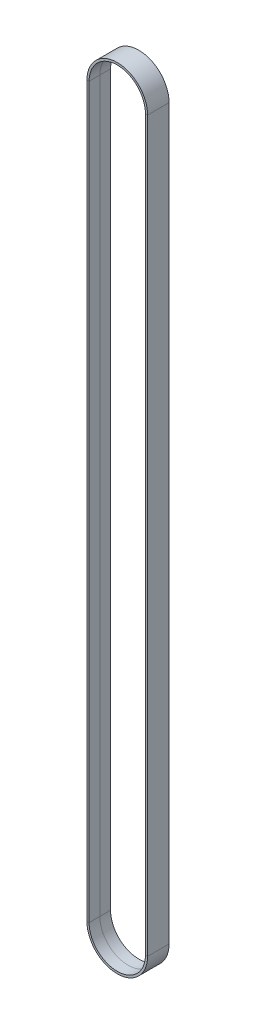
ISO-10303-21;
HEADER;
FILE_DESCRIPTION(('STEP AP214'),'2;1');
FILE_NAME('part.step','',(''),(''),'','','');
FILE_SCHEMA(('AUTOMOTIVE_DESIGN { 1 0 10303 214 1 1 1 1 }'));
ENDSEC;
DATA;
#1=APPLICATION_CONTEXT('core data for automotive mechanical design processes');
#2=APPLICATION_PROTOCOL_DEFINITION('international standard','automotive_design',2000,#1);
#3=PRODUCT_CONTEXT('',#1,'mechanical');
#4=PRODUCT('Part','Part','',(#3));
#5=PRODUCT_RELATED_PRODUCT_CATEGORY('part','',(#4));
#6=PRODUCT_DEFINITION_FORMATION('','',#4);
#7=PRODUCT_DEFINITION_CONTEXT('part definition',#1,'design');
#8=PRODUCT_DEFINITION('design','',#6,#7);
#9=PRODUCT_DEFINITION_SHAPE('','',#8);
#10=(LENGTH_UNIT() NAMED_UNIT(*) SI_UNIT(.MILLI.,.METRE.));
#11=(NAMED_UNIT(*) PLANE_ANGLE_UNIT() SI_UNIT($,.RADIAN.));
#12=(NAMED_UNIT(*) SI_UNIT($,.STERADIAN.) SOLID_ANGLE_UNIT());
#13=UNCERTAINTY_MEASURE_WITH_UNIT(LENGTH_MEASURE(1.E-05),#10,'distance_accuracy_value','');
#14=(GEOMETRIC_REPRESENTATION_CONTEXT(3) GLOBAL_UNCERTAINTY_ASSIGNED_CONTEXT((#13)) GLOBAL_UNIT_ASSIGNED_CONTEXT((#10,
#11,#12)) REPRESENTATION_CONTEXT('',''));
#15=CARTESIAN_POINT('',(0.,0.,0.));
#16=DIRECTION('',(0.,0.,1.));
#17=DIRECTION('',(1.,0.,0.));
#18=AXIS2_PLACEMENT_3D('',#15,#16,#17);
#19=CARTESIAN_POINT('',(-26.2499999999862,-7.0265520336124E-13,9.99999999999998));
#20=DIRECTION('',(0.,0.,-1.));
#21=DIRECTION('',(-1.,0.,0.));
#22=AXIS2_PLACEMENT_3D('',#19,#20,#21);
#23=PLANE('',#22);
#24=DIRECTION('',(-1.,0.,0.));
#25=VECTOR('',#24,1.);
#26=CARTESIAN_POINT('',(-26.2499999999862,0.,9.99999999999998));
#27=LINE('',#26,#25);
#28=CARTESIAN_POINT('',(-26.2500000000138,-2.22044604925031E-13,9.99999999999998));
#29=VERTEX_POINT('',#28);
#30=CARTESIAN_POINT('',(-28.2500000000138,-2.22044604925031E-13,9.99999999999998));
#31=VERTEX_POINT('',#30);
#32=EDGE_CURVE('E168',#29,#31,#27,.T.);
#33=ORIENTED_EDGE('',*,*,#32,.F.);
#34=CARTESIAN_POINT('',(-1.37667655053519E-11,3.04201108747293E-11,9.99999999999998));
#35=DIRECTION('',(0.,0.,-1.));
#36=DIRECTION('',(-1.,-1.1856291839285E-12,0.));
#37=AXIS2_PLACEMENT_3D('',#34,#35,#36);
#38=CIRCLE('',#37,26.2499999999725);
#39=CARTESIAN_POINT('',(26.2499999999862,0.,9.99999999999998));
#40=VERTEX_POINT('',#39);
#41=EDGE_CURVE('E167',#29,#40,#38,.T.);
#42=ORIENTED_EDGE('',*,*,#41,.T.);
#43=DIRECTION('',(1.,0.,0.));
#44=VECTOR('',#43,1.);
#45=CARTESIAN_POINT('',(26.2499999999862,0.,9.99999999999998));
#46=LINE('',#45,#44);
#47=CARTESIAN_POINT('',(28.2499999999862,0.,9.99999999999998));
#48=VERTEX_POINT('',#47);
#49=EDGE_CURVE('E147',#40,#48,#46,.T.);
#50=ORIENTED_EDGE('',*,*,#49,.T.);
#51=CARTESIAN_POINT('',(-1.37667655053519E-11,3.04201108747293E-11,9.99999999999998));
#52=DIRECTION('',(0.,0.,-1.));
#53=DIRECTION('',(-1.,-1.1035859013332E-12,0.));
#54=AXIS2_PLACEMENT_3D('',#51,#52,#53);
#55=CIRCLE('',#54,28.2499999999725);
#56=EDGE_CURVE('E172',#31,#48,#55,.T.);
#57=ORIENTED_EDGE('',*,*,#56,.F.);
#58=EDGE_LOOP('',(#33,#42,#50,#57));
#59=FACE_BOUND('',#58,.T.);
#60=ADVANCED_FACE('F35',(#59),#23,.F.);
#61=CARTESIAN_POINT('',(26.2499999999862,0.,9.99999999999998));
#62=DIRECTION('',(0.,0.,-1.));
#63=DIRECTION('',(-1.,0.,0.));
#64=AXIS2_PLACEMENT_3D('',#61,#62,#63);
#65=PLANE('',#64);
#66=DIRECTION('',(0.,-1.,0.));
#67=VECTOR('',#66,1.);
#68=CARTESIAN_POINT('',(28.2499999999862,0.,9.99999999999998));
#69=LINE('',#68,#67);
#70=CARTESIAN_POINT('',(28.2499999999862,-678.678709754641,9.99999999999998));
#71=VERTEX_POINT('',#70);
#72=EDGE_CURVE('E130',#48,#71,#69,.T.);
#73=ORIENTED_EDGE('',*,*,#72,.F.);
#74=ORIENTED_EDGE('',*,*,#49,.F.);
#75=DIRECTION('',(0.,-1.,0.));
#76=VECTOR('',#75,1.);
#77=CARTESIAN_POINT('',(26.2499999999862,0.,9.99999999999998));
#78=LINE('',#77,#76);
#79=CARTESIAN_POINT('',(26.2499999999862,-678.678709754641,9.99999999999998));
#80=VERTEX_POINT('',#79);
#81=EDGE_CURVE('E152',#40,#80,#78,.T.);
#82=ORIENTED_EDGE('',*,*,#81,.T.);
#83=DIRECTION('',(1.,0.,0.));
#84=VECTOR('',#83,1.);
#85=CARTESIAN_POINT('',(26.2499999999862,-678.678709754641,9.99999999999998));
#86=LINE('',#85,#84);
#87=EDGE_CURVE('E164',#80,#71,#86,.T.);
#88=ORIENTED_EDGE('',*,*,#87,.T.);
#89=EDGE_LOOP('',(#73,#74,#82,#88));
#90=FACE_BOUND('',#89,.T.);
#91=ADVANCED_FACE('F151',(#90),#65,.F.);
#92=CARTESIAN_POINT('',(28.2499999999862,0.,9.99999999999998));
#93=DIRECTION('',(-1.,0.,0.));
#94=DIRECTION('',(0.,0.,1.));
#95=AXIS2_PLACEMENT_3D('',#92,#93,#94);
#96=PLANE('',#95);
#97=DIRECTION('',(0.,-1.,0.));
#98=VECTOR('',#97,1.);
#99=CARTESIAN_POINT('',(28.2499999999862,0.,-10.));
#100=LINE('',#99,#98);
#101=CARTESIAN_POINT('',(28.2499999999862,0.,-10.));
#102=VERTEX_POINT('',#101);
#103=CARTESIAN_POINT('',(28.2499999999862,-678.678709754641,-10.));
#104=VERTEX_POINT('',#103);
#105=EDGE_CURVE('E123',#102,#104,#100,.T.);
#106=ORIENTED_EDGE('',*,*,#105,.F.);
#107=DIRECTION('',(0.,0.,-1.));
#108=VECTOR('',#107,1.);
#109=CARTESIAN_POINT('',(28.2499999999862,0.,9.99999999999998));
#110=LINE('',#109,#108);
#111=EDGE_CURVE('E154',#48,#102,#110,.T.);
#112=ORIENTED_EDGE('',*,*,#111,.F.);
#113=ORIENTED_EDGE('',*,*,#72,.T.);
#114=DIRECTION('',(0.,0.,-1.));
#115=VECTOR('',#114,1.);
#116=CARTESIAN_POINT('',(28.2499999999862,-678.678709754641,9.99999999999998));
#117=LINE('',#116,#115);
#118=EDGE_CURVE('E230',#71,#104,#117,.T.);
#119=ORIENTED_EDGE('',*,*,#118,.T.);
#120=EDGE_LOOP('',(#106,#112,#113,#119));
#121=FACE_BOUND('',#120,.T.);
#122=ADVANCED_FACE('F252',(#121),#96,.F.);
#123=CARTESIAN_POINT('',(26.2499999999862,0.,-10.));
#124=DIRECTION('',(0.,0.,1.));
#125=DIRECTION('',(1.,0.,0.));
#126=AXIS2_PLACEMENT_3D('',#123,#124,#125);
#127=PLANE('',#126);
#128=DIRECTION('',(0.,-1.,0.));
#129=VECTOR('',#128,1.);
#130=CARTESIAN_POINT('',(26.2499999999862,0.,-10.));
#131=LINE('',#130,#129);
#132=CARTESIAN_POINT('',(26.2499999999862,0.,-10.));
#133=VERTEX_POINT('',#132);
#134=CARTESIAN_POINT('',(26.2499999999862,-678.678709754641,-10.));
#135=VERTEX_POINT('',#134);
#136=EDGE_CURVE('E116',#133,#135,#131,.T.);
#137=ORIENTED_EDGE('',*,*,#136,.F.);
#138=DIRECTION('',(-1.,0.,0.));
#139=VECTOR('',#138,1.);
#140=CARTESIAN_POINT('',(26.2499999999862,0.,-10.));
#141=LINE('',#140,#139);
#142=EDGE_CURVE('E178',#102,#133,#141,.T.);
#143=ORIENTED_EDGE('',*,*,#142,.F.);
#144=ORIENTED_EDGE('',*,*,#105,.T.);
#145=DIRECTION('',(-1.,0.,0.));
#146=VECTOR('',#145,1.);
#147=CARTESIAN_POINT('',(26.2499999999862,-678.678709754641,-10.));
#148=LINE('',#147,#146);
#149=EDGE_CURVE('E214',#104,#135,#148,.T.);
#150=ORIENTED_EDGE('',*,*,#149,.T.);
#151=EDGE_LOOP('',(#137,#143,#144,#150));
#152=FACE_BOUND('',#151,.T.);
#153=ADVANCED_FACE('F254',(#152),#127,.F.);
#154=CARTESIAN_POINT('',(26.2499999999862,0.,0.));
#155=DIRECTION('',(1.,0.,0.));
#156=DIRECTION('',(0.,0.,-1.));
#157=AXIS2_PLACEMENT_3D('',#154,#155,#156);
#158=PLANE('',#157);
#159=DIRECTION('',(0.,-1.,0.));
#160=VECTOR('',#159,1.);
#161=CARTESIAN_POINT('',(26.2499999999862,0.,0.));
#162=LINE('',#161,#160);
#163=CARTESIAN_POINT('',(26.2499999999862,0.,0.));
#164=VERTEX_POINT('',#163);
#165=CARTESIAN_POINT('',(26.2499999999862,-678.678709754641,0.));
#166=VERTEX_POINT('',#165);
#167=EDGE_CURVE('E183',#164,#166,#162,.T.);
#168=ORIENTED_EDGE('',*,*,#167,.F.);
#169=DIRECTION('',(0.,0.,1.));
#170=VECTOR('',#169,1.);
#171=CARTESIAN_POINT('',(26.2499999999862,0.,0.));
#172=LINE('',#171,#170);
#173=EDGE_CURVE('E175',#133,#164,#172,.T.);
#174=ORIENTED_EDGE('',*,*,#173,.F.);
#175=ORIENTED_EDGE('',*,*,#136,.T.);
#176=DIRECTION('',(0.,0.,1.));
#177=VECTOR('',#176,1.);
#178=CARTESIAN_POINT('',(26.2499999999862,-678.678709754641,0.));
#179=LINE('',#178,#177);
#180=EDGE_CURVE('E201',#135,#166,#179,.T.);
#181=ORIENTED_EDGE('',*,*,#180,.T.);
#182=EDGE_LOOP('',(#168,#174,#175,#181));
#183=FACE_BOUND('',#182,.T.);
#184=ADVANCED_FACE('F200',(#183),#158,.F.);
#185=CARTESIAN_POINT('',(26.2499999999862,0.,0.));
#186=DIRECTION('',(1.,0.,0.));
#187=DIRECTION('',(0.,0.,-1.));
#188=AXIS2_PLACEMENT_3D('',#185,#186,#187);
#189=PLANE('',#188);
#190=DIRECTION('',(0.,0.,1.));
#191=VECTOR('',#190,1.);
#192=CARTESIAN_POINT('',(26.2499999999862,-678.678709754641,0.));
#193=LINE('',#192,#191);
#194=EDGE_CURVE('E162',#166,#80,#193,.T.);
#195=ORIENTED_EDGE('',*,*,#194,.T.);
#196=ORIENTED_EDGE('',*,*,#81,.F.);
#197=DIRECTION('',(0.,0.,1.));
#198=VECTOR('',#197,1.);
#199=CARTESIAN_POINT('',(26.2499999999862,0.,0.));
#200=LINE('',#199,#198);
#201=EDGE_CURVE('E161',#164,#40,#200,.T.);
#202=ORIENTED_EDGE('',*,*,#201,.F.);
#203=ORIENTED_EDGE('',*,*,#167,.T.);
#204=EDGE_LOOP('',(#195,#196,#202,#203));
#205=FACE_BOUND('',#204,.T.);
#206=ADVANCED_FACE('F159',(#205),#189,.F.);
#207=CARTESIAN_POINT('',(26.2499999999862,-678.678709754642,9.99999999999998));
#208=DIRECTION('',(0.,0.,-1.));
#209=DIRECTION('',(-1.,0.,0.));
#210=AXIS2_PLACEMENT_3D('',#207,#208,#209);
#211=PLANE('',#210);
#212=CARTESIAN_POINT('',(-1.37667655053519E-11,-678.678709754611,9.99999999999998));
#213=DIRECTION('',(0.,0.,-1.));
#214=DIRECTION('',(1.,-1.10039804210635E-12,0.));
#215=AXIS2_PLACEMENT_3D('',#212,#213,#214);
#216=CIRCLE('',#215,28.25);
#217=CARTESIAN_POINT('',(-28.2500000000138,-678.67870975458,9.99999999999998));
#218=VERTEX_POINT('',#217);
#219=EDGE_CURVE('E228',#71,#218,#216,.T.);
#220=ORIENTED_EDGE('',*,*,#219,.F.);
#221=ORIENTED_EDGE('',*,*,#87,.F.);
#222=CARTESIAN_POINT('',(-1.37667655053519E-11,-678.678709754611,9.99999999999998));
#223=DIRECTION('',(0.,0.,-1.));
#224=DIRECTION('',(1.,-1.1842378929335E-12,0.));
#225=AXIS2_PLACEMENT_3D('',#222,#223,#224);
#226=CIRCLE('',#225,26.25);
#227=CARTESIAN_POINT('',(-26.2500000000138,-678.67870975458,9.99999999999998));
#228=VERTEX_POINT('',#227);
#229=EDGE_CURVE('E182',#80,#228,#226,.T.);
#230=ORIENTED_EDGE('',*,*,#229,.T.);
#231=DIRECTION('',(-1.,0.,0.));
#232=VECTOR('',#231,1.);
#233=CARTESIAN_POINT('',(-26.2500000000138,-678.67870975458,9.99999999999998));
#234=LINE('',#233,#232);
#235=EDGE_CURVE('E239',#228,#218,#234,.T.);
#236=ORIENTED_EDGE('',*,*,#235,.T.);
#237=EDGE_LOOP('',(#220,#221,#230,#236));
#238=FACE_BOUND('',#237,.T.);
#239=ADVANCED_FACE('F247',(#238),#211,.F.);
#240=CARTESIAN_POINT('',(-1.37667655053519E-11,-678.678709754611,0.));
#241=DIRECTION('',(0.,0.,-1.));
#242=DIRECTION('',(-1.,0.,0.));
#243=AXIS2_PLACEMENT_3D('',#240,#241,#242);
#244=CYLINDRICAL_SURFACE('',#243,28.25);
#245=CARTESIAN_POINT('',(-1.37667655053519E-11,-678.678709754611,-10.));
#246=DIRECTION('',(0.,0.,-1.));
#247=DIRECTION('',(1.,-1.10039804210635E-12,0.));
#248=AXIS2_PLACEMENT_3D('',#245,#246,#247);
#249=CIRCLE('',#248,28.25);
#250=CARTESIAN_POINT('',(-28.2500000000138,-678.67870975458,-10.));
#251=VERTEX_POINT('',#250);
#252=EDGE_CURVE('E102',#104,#251,#249,.T.);
#253=ORIENTED_EDGE('',*,*,#252,.F.);
#254=ORIENTED_EDGE('',*,*,#118,.F.);
#255=ORIENTED_EDGE('',*,*,#219,.T.);
#256=DIRECTION('',(0.,0.,-1.));
#257=VECTOR('',#256,1.);
#258=CARTESIAN_POINT('',(-28.2500000000138,-678.67870975458,9.99999999999998));
#259=LINE('',#258,#257);
#260=EDGE_CURVE('E226',#218,#251,#259,.T.);
#261=ORIENTED_EDGE('',*,*,#260,.T.);
#262=EDGE_LOOP('',(#253,#254,#255,#261));
#263=FACE_BOUND('',#262,.T.);
#264=ADVANCED_FACE('F251',(#263),#244,.T.);
#265=CARTESIAN_POINT('',(26.2499999999862,-678.678709754642,-10.));
#266=DIRECTION('',(0.,0.,1.));
#267=DIRECTION('',(1.,0.,0.));
#268=AXIS2_PLACEMENT_3D('',#265,#266,#267);
#269=PLANE('',#268);
#270=CARTESIAN_POINT('',(-1.37667655053519E-11,-678.678709754611,-10.));
#271=DIRECTION('',(0.,0.,-1.));
#272=DIRECTION('',(1.,-1.1842378929335E-12,0.));
#273=AXIS2_PLACEMENT_3D('',#270,#271,#272);
#274=CIRCLE('',#273,26.25);
#275=CARTESIAN_POINT('',(-26.2500000000138,-678.67870975458,-10.));
#276=VERTEX_POINT('',#275);
#277=EDGE_CURVE('E94',#135,#276,#274,.T.);
#278=ORIENTED_EDGE('',*,*,#277,.F.);
#279=ORIENTED_EDGE('',*,*,#149,.F.);
#280=ORIENTED_EDGE('',*,*,#252,.T.);
#281=DIRECTION('',(1.,0.,0.));
#282=VECTOR('',#281,1.);
#283=CARTESIAN_POINT('',(-26.2500000000138,-678.67870975458,-10.));
#284=LINE('',#283,#282);
#285=EDGE_CURVE('E211',#251,#276,#284,.T.);
#286=ORIENTED_EDGE('',*,*,#285,.T.);
#287=EDGE_LOOP('',(#278,#279,#280,#286));
#288=FACE_BOUND('',#287,.T.);
#289=ADVANCED_FACE('F279',(#288),#269,.F.);
#290=CARTESIAN_POINT('',(-1.37667655053519E-11,-678.678709754611,0.));
#291=DIRECTION('',(0.,0.,-1.));
#292=DIRECTION('',(-1.,0.,0.));
#293=AXIS2_PLACEMENT_3D('',#290,#291,#292);
#294=CYLINDRICAL_SURFACE('',#293,26.25);
#295=CARTESIAN_POINT('',(-1.37667655053519E-11,-678.678709754611,0.));
#296=DIRECTION('',(0.,0.,-1.));
#297=DIRECTION('',(1.,-1.1842378929335E-12,0.));
#298=AXIS2_PLACEMENT_3D('',#295,#296,#297);
#299=CIRCLE('',#298,26.25);
#300=CARTESIAN_POINT('',(-26.2500000000138,-678.67870975458,0.));
#301=VERTEX_POINT('',#300);
#302=EDGE_CURVE('E85',#166,#301,#299,.T.);
#303=ORIENTED_EDGE('',*,*,#302,.F.);
#304=ORIENTED_EDGE('',*,*,#180,.F.);
#305=ORIENTED_EDGE('',*,*,#277,.T.);
#306=DIRECTION('',(0.,0.,1.));
#307=VECTOR('',#306,1.);
#308=CARTESIAN_POINT('',(-26.2500000000138,-678.67870975458,0.));
#309=LINE('',#308,#307);
#310=EDGE_CURVE('E188',#276,#301,#309,.T.);
#311=ORIENTED_EDGE('',*,*,#310,.T.);
#312=EDGE_LOOP('',(#303,#304,#305,#311));
#313=FACE_BOUND('',#312,.T.);
#314=ADVANCED_FACE('F289',(#313),#294,.F.);
#315=CARTESIAN_POINT('',(-1.37667655053519E-11,-678.678709754611,0.));
#316=DIRECTION('',(0.,0.,-1.));
#317=DIRECTION('',(-1.,0.,0.));
#318=AXIS2_PLACEMENT_3D('',#315,#316,#317);
#319=CYLINDRICAL_SURFACE('',#318,26.25);
#320=DIRECTION('',(0.,0.,1.));
#321=VECTOR('',#320,1.);
#322=CARTESIAN_POINT('',(-26.2500000000138,-678.67870975458,0.));
#323=LINE('',#322,#321);
#324=EDGE_CURVE('E184',#301,#228,#323,.T.);
#325=ORIENTED_EDGE('',*,*,#324,.T.);
#326=ORIENTED_EDGE('',*,*,#229,.F.);
#327=ORIENTED_EDGE('',*,*,#194,.F.);
#328=ORIENTED_EDGE('',*,*,#302,.T.);
#329=EDGE_LOOP('',(#325,#326,#327,#328));
#330=FACE_BOUND('',#329,.T.);
#331=ADVANCED_FACE('F272',(#330),#319,.F.);
#332=CARTESIAN_POINT('',(-26.2500000000138,-678.67870975458,9.99999999999998));
#333=DIRECTION('',(0.,0.,-1.));
#334=DIRECTION('',(-1.,0.,0.));
#335=AXIS2_PLACEMENT_3D('',#332,#333,#334);
#336=PLANE('',#335);
#337=DIRECTION('',(0.,1.,0.));
#338=VECTOR('',#337,1.);
#339=CARTESIAN_POINT('',(-28.2500000000138,-678.67870975458,9.99999999999998));
#340=LINE('',#339,#338);
#341=EDGE_CURVE('E224',#218,#31,#340,.T.);
#342=ORIENTED_EDGE('',*,*,#341,.F.);
#343=ORIENTED_EDGE('',*,*,#235,.F.);
#344=DIRECTION('',(0.,1.,0.));
#345=VECTOR('',#344,1.);
#346=CARTESIAN_POINT('',(-26.2500000000138,-678.67870975458,9.99999999999998));
#347=LINE('',#346,#345);
#348=EDGE_CURVE('E185',#228,#29,#347,.T.);
#349=ORIENTED_EDGE('',*,*,#348,.T.);
#350=ORIENTED_EDGE('',*,*,#32,.T.);
#351=EDGE_LOOP('',(#342,#343,#349,#350));
#352=FACE_BOUND('',#351,.T.);
#353=ADVANCED_FACE('F268',(#352),#336,.F.);
#354=CARTESIAN_POINT('',(-28.2500000000138,-678.67870975458,9.99999999999998));
#355=DIRECTION('',(1.,0.,0.));
#356=DIRECTION('',(0.,0.,-1.));
#357=AXIS2_PLACEMENT_3D('',#354,#355,#356);
#358=PLANE('',#357);
#359=DIRECTION('',(0.,1.,0.));
#360=VECTOR('',#359,1.);
#361=CARTESIAN_POINT('',(-28.2500000000138,-678.67870975458,-10.));
#362=LINE('',#361,#360);
#363=CARTESIAN_POINT('',(-28.2500000000138,-2.22044604925031E-13,-10.));
#364=VERTEX_POINT('',#363);
#365=EDGE_CURVE('E209',#251,#364,#362,.T.);
#366=ORIENTED_EDGE('',*,*,#365,.F.);
#367=ORIENTED_EDGE('',*,*,#260,.F.);
#368=ORIENTED_EDGE('',*,*,#341,.T.);
#369=DIRECTION('',(0.,0.,-1.));
#370=VECTOR('',#369,1.);
#371=CARTESIAN_POINT('',(-28.2499999999862,0.,9.99999999999998));
#372=LINE('',#371,#370);
#373=EDGE_CURVE('E221',#31,#364,#372,.T.);
#374=ORIENTED_EDGE('',*,*,#373,.T.);
#375=EDGE_LOOP('',(#366,#367,#368,#374));
#376=FACE_BOUND('',#375,.T.);
#377=ADVANCED_FACE('F271',(#376),#358,.F.);
#378=CARTESIAN_POINT('',(-26.2500000000138,-678.67870975458,-10.));
#379=DIRECTION('',(0.,0.,1.));
#380=DIRECTION('',(1.,0.,0.));
#381=AXIS2_PLACEMENT_3D('',#378,#379,#380);
#382=PLANE('',#381);
#383=DIRECTION('',(0.,1.,0.));
#384=VECTOR('',#383,1.);
#385=CARTESIAN_POINT('',(-26.2500000000138,-678.67870975458,-10.));
#386=LINE('',#385,#384);
#387=CARTESIAN_POINT('',(-26.2500000000138,-2.22044604925031E-13,-10.));
#388=VERTEX_POINT('',#387);
#389=EDGE_CURVE('E60',#276,#388,#386,.T.);
#390=ORIENTED_EDGE('',*,*,#389,.F.);
#391=ORIENTED_EDGE('',*,*,#285,.F.);
#392=ORIENTED_EDGE('',*,*,#365,.T.);
#393=DIRECTION('',(1.,0.,0.));
#394=VECTOR('',#393,1.);
#395=CARTESIAN_POINT('',(-26.2499999999862,0.,-10.));
#396=LINE('',#395,#394);
#397=EDGE_CURVE('E207',#364,#388,#396,.T.);
#398=ORIENTED_EDGE('',*,*,#397,.T.);
#399=EDGE_LOOP('',(#390,#391,#392,#398));
#400=FACE_BOUND('',#399,.T.);
#401=ADVANCED_FACE('F300',(#400),#382,.F.);
#402=CARTESIAN_POINT('',(-26.2500000000138,-678.67870975458,0.));
#403=DIRECTION('',(-1.,0.,0.));
#404=DIRECTION('',(0.,0.,1.));
#405=AXIS2_PLACEMENT_3D('',#402,#403,#404);
#406=PLANE('',#405);
#407=DIRECTION('',(0.,1.,0.));
#408=VECTOR('',#407,1.);
#409=CARTESIAN_POINT('',(-26.2500000000138,-678.67870975458,0.));
#410=LINE('',#409,#408);
#411=CARTESIAN_POINT('',(-26.2500000000138,-2.22044604925031E-13,0.));
#412=VERTEX_POINT('',#411);
#413=EDGE_CURVE('E52',#301,#412,#410,.T.);
#414=ORIENTED_EDGE('',*,*,#413,.F.);
#415=ORIENTED_EDGE('',*,*,#310,.F.);
#416=ORIENTED_EDGE('',*,*,#389,.T.);
#417=DIRECTION('',(0.,0.,1.));
#418=VECTOR('',#417,1.);
#419=CARTESIAN_POINT('',(-26.2499999999862,0.,0.));
#420=LINE('',#419,#418);
#421=EDGE_CURVE('E193',#388,#412,#420,.T.);
#422=ORIENTED_EDGE('',*,*,#421,.T.);
#423=EDGE_LOOP('',(#414,#415,#416,#422));
#424=FACE_BOUND('',#423,.T.);
#425=ADVANCED_FACE('F292',(#424),#406,.F.);
#426=CARTESIAN_POINT('',(-26.2500000000138,-678.67870975458,0.));
#427=DIRECTION('',(-1.,0.,0.));
#428=DIRECTION('',(0.,0.,1.));
#429=AXIS2_PLACEMENT_3D('',#426,#427,#428);
#430=PLANE('',#429);
#431=DIRECTION('',(0.,0.,1.));
#432=VECTOR('',#431,1.);
#433=CARTESIAN_POINT('',(-26.2499999999862,0.,0.));
#434=LINE('',#433,#432);
#435=EDGE_CURVE('E39',#412,#29,#434,.T.);
#436=ORIENTED_EDGE('',*,*,#435,.T.);
#437=ORIENTED_EDGE('',*,*,#348,.F.);
#438=ORIENTED_EDGE('',*,*,#324,.F.);
#439=ORIENTED_EDGE('',*,*,#413,.T.);
#440=EDGE_LOOP('',(#436,#437,#438,#439));
#441=FACE_BOUND('',#440,.T.);
#442=ADVANCED_FACE('F194',(#441),#430,.F.);
#443=CARTESIAN_POINT('',(-1.37667655053519E-11,3.04201108747293E-11,0.));
#444=DIRECTION('',(0.,0.,-1.));
#445=DIRECTION('',(-1.,0.,0.));
#446=AXIS2_PLACEMENT_3D('',#443,#444,#445);
#447=CYLINDRICAL_SURFACE('',#446,28.2499999999725);
#448=ORIENTED_EDGE('',*,*,#56,.T.);
#449=ORIENTED_EDGE('',*,*,#111,.T.);
#450=CARTESIAN_POINT('',(-1.37667655053519E-11,3.04201108747293E-11,-10.));
#451=DIRECTION('',(0.,0.,-1.));
#452=DIRECTION('',(-1.,-1.1035859013332E-12,0.));
#453=AXIS2_PLACEMENT_3D('',#450,#451,#452);
#454=CIRCLE('',#453,28.2499999999725);
#455=EDGE_CURVE('E205',#364,#102,#454,.T.);
#456=ORIENTED_EDGE('',*,*,#455,.F.);
#457=ORIENTED_EDGE('',*,*,#373,.F.);
#458=EDGE_LOOP('',(#448,#449,#456,#457));
#459=FACE_BOUND('',#458,.T.);
#460=ADVANCED_FACE('F291',(#459),#447,.T.);
#461=CARTESIAN_POINT('',(-26.2499999999862,-7.0265520336124E-13,-10.));
#462=DIRECTION('',(0.,0.,1.));
#463=DIRECTION('',(1.,0.,0.));
#464=AXIS2_PLACEMENT_3D('',#461,#462,#463);
#465=PLANE('',#464);
#466=ORIENTED_EDGE('',*,*,#455,.T.);
#467=ORIENTED_EDGE('',*,*,#142,.T.);
#468=CARTESIAN_POINT('',(-1.37667655053519E-11,3.04201108747293E-11,-10.));
#469=DIRECTION('',(0.,0.,-1.));
#470=DIRECTION('',(-1.,-1.1856291839285E-12,0.));
#471=AXIS2_PLACEMENT_3D('',#468,#469,#470);
#472=CIRCLE('',#471,26.2499999999725);
#473=EDGE_CURVE('E44',#388,#133,#472,.T.);
#474=ORIENTED_EDGE('',*,*,#473,.F.);
#475=ORIENTED_EDGE('',*,*,#397,.F.);
#476=EDGE_LOOP('',(#466,#467,#474,#475));
#477=FACE_BOUND('',#476,.T.);
#478=ADVANCED_FACE('F297',(#477),#465,.F.);
#479=CARTESIAN_POINT('',(-1.37667655053519E-11,3.04201108747293E-11,0.));
#480=DIRECTION('',(0.,0.,-1.));
#481=DIRECTION('',(-1.,0.,0.));
#482=AXIS2_PLACEMENT_3D('',#479,#480,#481);
#483=CYLINDRICAL_SURFACE('',#482,26.2499999999725);
#484=ORIENTED_EDGE('',*,*,#473,.T.);
#485=ORIENTED_EDGE('',*,*,#173,.T.);
#486=CARTESIAN_POINT('',(-1.37667655053519E-11,3.04201108747293E-11,0.));
#487=DIRECTION('',(0.,0.,-1.));
#488=DIRECTION('',(-1.,-1.1856291839285E-12,0.));
#489=AXIS2_PLACEMENT_3D('',#486,#487,#488);
#490=CIRCLE('',#489,26.2499999999725);
#491=EDGE_CURVE('E11',#412,#164,#490,.T.);
#492=ORIENTED_EDGE('',*,*,#491,.F.);
#493=ORIENTED_EDGE('',*,*,#421,.F.);
#494=EDGE_LOOP('',(#484,#485,#492,#493));
#495=FACE_BOUND('',#494,.T.);
#496=ADVANCED_FACE('F198',(#495),#483,.F.);
#497=CARTESIAN_POINT('',(-1.37667655053519E-11,3.04201108747293E-11,0.));
#498=DIRECTION('',(0.,0.,-1.));
#499=DIRECTION('',(-1.,0.,0.));
#500=AXIS2_PLACEMENT_3D('',#497,#498,#499);
#501=CYLINDRICAL_SURFACE('',#500,26.2499999999725);
#502=ORIENTED_EDGE('',*,*,#491,.T.);
#503=ORIENTED_EDGE('',*,*,#201,.T.);
#504=ORIENTED_EDGE('',*,*,#41,.F.);
#505=ORIENTED_EDGE('',*,*,#435,.F.);
#506=EDGE_LOOP('',(#502,#503,#504,#505));
#507=FACE_BOUND('',#506,.T.);
#508=ADVANCED_FACE('F37',(#507),#501,.F.);
#509=CLOSED_SHELL('',(#60,#91,#122,#153,#184,#206,#239,#264,#289,#314,#331,#353,#377,#401,#425,
#442,#460,#478,#496,#508));
#510=MANIFOLD_SOLID_BREP('B2',#509);
#511=ADVANCED_BREP_SHAPE_REPRESENTATION('',(#18,#510),#14);
#512=SHAPE_DEFINITION_REPRESENTATION(#9,#511);
ENDSEC;
END-ISO-10303-21;
